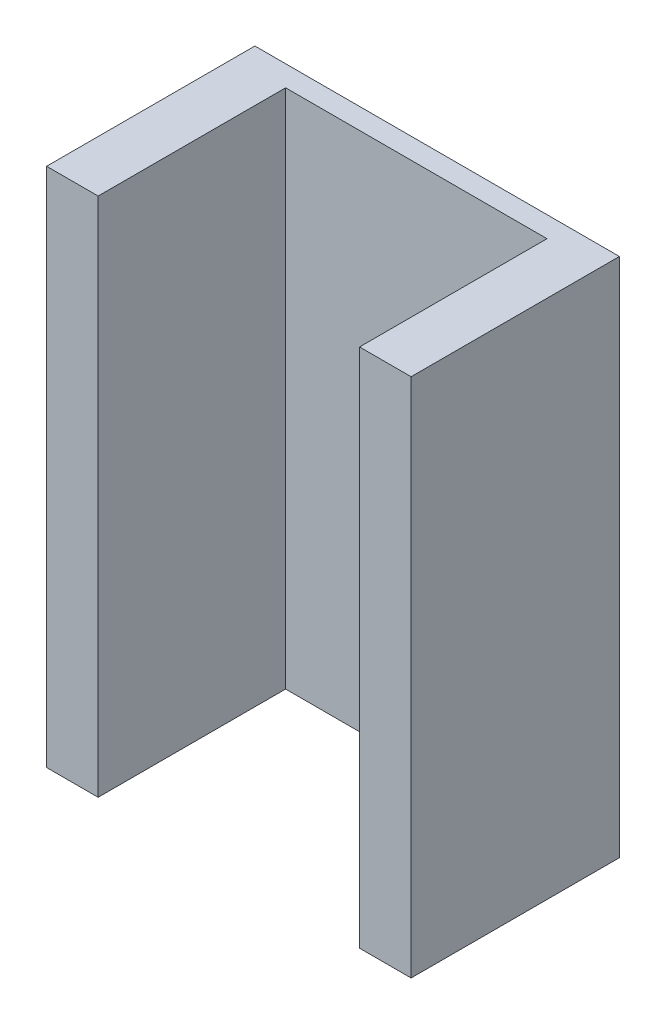
ISO-10303-21;
HEADER;
FILE_DESCRIPTION(('STEP AP214'),'2;1');
FILE_NAME('part.step','',(''),(''),'','','');
FILE_SCHEMA(('AUTOMOTIVE_DESIGN { 1 0 10303 214 1 1 1 1 }'));
ENDSEC;
DATA;
#1=APPLICATION_CONTEXT('core data for automotive mechanical design processes');
#2=APPLICATION_PROTOCOL_DEFINITION('international standard','automotive_design',2000,#1);
#3=PRODUCT_CONTEXT('',#1,'mechanical');
#4=PRODUCT('Part','Part','',(#3));
#5=PRODUCT_RELATED_PRODUCT_CATEGORY('part','',(#4));
#6=PRODUCT_DEFINITION_FORMATION('','',#4);
#7=PRODUCT_DEFINITION_CONTEXT('part definition',#1,'design');
#8=PRODUCT_DEFINITION('design','',#6,#7);
#9=PRODUCT_DEFINITION_SHAPE('','',#8);
#10=(LENGTH_UNIT() NAMED_UNIT(*) SI_UNIT(.MILLI.,.METRE.));
#11=(NAMED_UNIT(*) PLANE_ANGLE_UNIT() SI_UNIT($,.RADIAN.));
#12=(NAMED_UNIT(*) SI_UNIT($,.STERADIAN.) SOLID_ANGLE_UNIT());
#13=UNCERTAINTY_MEASURE_WITH_UNIT(LENGTH_MEASURE(1.E-05),#10,'distance_accuracy_value','');
#14=(GEOMETRIC_REPRESENTATION_CONTEXT(3) GLOBAL_UNCERTAINTY_ASSIGNED_CONTEXT((#13)) GLOBAL_UNIT_ASSIGNED_CONTEXT((#10,
#11,#12)) REPRESENTATION_CONTEXT('',''));
#15=CARTESIAN_POINT('',(0.,0.,0.));
#16=DIRECTION('',(0.,0.,1.));
#17=DIRECTION('',(1.,0.,0.));
#18=AXIS2_PLACEMENT_3D('',#15,#16,#17);
#19=CARTESIAN_POINT('',(0.,0.,40.));
#20=DIRECTION('',(0.,0.,-1.));
#21=DIRECTION('',(-1.,0.,0.));
#22=AXIS2_PLACEMENT_3D('',#19,#20,#21);
#23=PLANE('',#22);
#24=DIRECTION('',(1.,0.,0.));
#25=VECTOR('',#24,1.);
#26=CARTESIAN_POINT('',(0.,0.,40.));
#27=LINE('',#26,#25);
#28=CARTESIAN_POINT('',(0.,0.,40.));
#29=VERTEX_POINT('',#28);
#30=CARTESIAN_POINT('',(9.90000000000001,0.,40.));
#31=VERTEX_POINT('',#30);
#32=EDGE_CURVE('E91',#29,#31,#27,.T.);
#33=ORIENTED_EDGE('',*,*,#32,.T.);
#34=DIRECTION('',(0.,-1.,0.));
#35=VECTOR('',#34,1.);
#36=CARTESIAN_POINT('',(9.9,100.,40.));
#37=LINE('',#36,#35);
#38=CARTESIAN_POINT('',(9.9,100.,40.));
#39=VERTEX_POINT('',#38);
#40=EDGE_CURVE('E117',#39,#31,#37,.T.);
#41=ORIENTED_EDGE('',*,*,#40,.F.);
#42=DIRECTION('',(-1.,0.,0.));
#43=VECTOR('',#42,1.);
#44=CARTESIAN_POINT('',(0.,100.,40.));
#45=LINE('',#44,#43);
#46=CARTESIAN_POINT('',(0.,100.,40.));
#47=VERTEX_POINT('',#46);
#48=EDGE_CURVE('E62',#39,#47,#45,.T.);
#49=ORIENTED_EDGE('',*,*,#48,.T.);
#50=DIRECTION('',(0.,-1.,0.));
#51=VECTOR('',#50,1.);
#52=CARTESIAN_POINT('',(0.,0.,40.));
#53=LINE('',#52,#51);
#54=EDGE_CURVE('E148',#47,#29,#53,.T.);
#55=ORIENTED_EDGE('',*,*,#54,.T.);
#56=EDGE_LOOP('',(#33,#41,#49,#55));
#57=FACE_BOUND('',#56,.T.);
#58=ADVANCED_FACE('F38',(#57),#23,.F.);
#59=CARTESIAN_POINT('',(0.,0.,40.));
#60=DIRECTION('',(1.,0.,0.));
#61=DIRECTION('',(0.,0.,-1.));
#62=AXIS2_PLACEMENT_3D('',#59,#60,#61);
#63=PLANE('',#62);
#64=DIRECTION('',(0.,-1.,0.));
#65=VECTOR('',#64,1.);
#66=CARTESIAN_POINT('',(0.,0.,0.));
#67=LINE('',#66,#65);
#68=CARTESIAN_POINT('',(0.,100.,0.));
#69=VERTEX_POINT('',#68);
#70=CARTESIAN_POINT('',(0.,0.,0.));
#71=VERTEX_POINT('',#70);
#72=EDGE_CURVE('E143',#69,#71,#67,.T.);
#73=ORIENTED_EDGE('',*,*,#72,.T.);
#74=DIRECTION('',(0.,0.,-1.));
#75=VECTOR('',#74,1.);
#76=CARTESIAN_POINT('',(0.,0.,40.));
#77=LINE('',#76,#75);
#78=EDGE_CURVE('E11',#29,#71,#77,.T.);
#79=ORIENTED_EDGE('',*,*,#78,.F.);
#80=ORIENTED_EDGE('',*,*,#54,.F.);
#81=DIRECTION('',(0.,0.,-1.));
#82=VECTOR('',#81,1.);
#83=CARTESIAN_POINT('',(0.,100.,40.));
#84=LINE('',#83,#82);
#85=EDGE_CURVE('E157',#47,#69,#84,.T.);
#86=ORIENTED_EDGE('',*,*,#85,.T.);
#87=EDGE_LOOP('',(#73,#79,#80,#86));
#88=FACE_BOUND('',#87,.T.);
#89=ADVANCED_FACE('F40',(#88),#63,.F.);
#90=CARTESIAN_POINT('',(0.,0.,40.));
#91=DIRECTION('',(0.,1.,0.));
#92=DIRECTION('',(0.,0.,1.));
#93=AXIS2_PLACEMENT_3D('',#90,#91,#92);
#94=PLANE('',#93);
#95=DIRECTION('',(1.,0.,0.));
#96=VECTOR('',#95,1.);
#97=CARTESIAN_POINT('',(9.90000000000001,0.,4.));
#98=LINE('',#97,#96);
#99=CARTESIAN_POINT('',(9.90000000000001,0.,4.));
#100=VERTEX_POINT('',#99);
#101=CARTESIAN_POINT('',(60.1,0.,4.));
#102=VERTEX_POINT('',#101);
#103=EDGE_CURVE('E125',#100,#102,#98,.T.);
#104=ORIENTED_EDGE('',*,*,#103,.F.);
#105=DIRECTION('',(0.,0.,1.));
#106=VECTOR('',#105,1.);
#107=CARTESIAN_POINT('',(9.90000000000001,0.,4.));
#108=LINE('',#107,#106);
#109=EDGE_CURVE('E112',#100,#31,#108,.T.);
#110=ORIENTED_EDGE('',*,*,#109,.T.);
#111=ORIENTED_EDGE('',*,*,#32,.F.);
#112=ORIENTED_EDGE('',*,*,#78,.T.);
#113=DIRECTION('',(1.,0.,0.));
#114=VECTOR('',#113,1.);
#115=CARTESIAN_POINT('',(0.,0.,0.));
#116=LINE('',#115,#114);
#117=CARTESIAN_POINT('',(70.,0.,0.));
#118=VERTEX_POINT('',#117);
#119=EDGE_CURVE('E160',#71,#118,#116,.T.);
#120=ORIENTED_EDGE('',*,*,#119,.T.);
#121=DIRECTION('',(0.,0.,-1.));
#122=VECTOR('',#121,1.);
#123=CARTESIAN_POINT('',(70.,0.,40.));
#124=LINE('',#123,#122);
#125=CARTESIAN_POINT('',(70.,0.,40.));
#126=VERTEX_POINT('',#125);
#127=EDGE_CURVE('E46',#126,#118,#124,.T.);
#128=ORIENTED_EDGE('',*,*,#127,.F.);
#129=CARTESIAN_POINT('',(60.1,0.,40.));
#130=VERTEX_POINT('',#129);
#131=EDGE_CURVE('E150',#130,#126,#27,.T.);
#132=ORIENTED_EDGE('',*,*,#131,.F.);
#133=DIRECTION('',(0.,0.,1.));
#134=VECTOR('',#133,1.);
#135=CARTESIAN_POINT('',(60.1,0.,4.));
#136=LINE('',#135,#134);
#137=EDGE_CURVE('E53',#102,#130,#136,.T.);
#138=ORIENTED_EDGE('',*,*,#137,.F.);
#139=EDGE_LOOP('',(#104,#110,#111,#112,#120,#128,#132,#138));
#140=FACE_BOUND('',#139,.T.);
#141=ADVANCED_FACE('F130',(#140),#94,.F.);
#142=CARTESIAN_POINT('',(70.,0.,40.));
#143=DIRECTION('',(-1.,0.,0.));
#144=DIRECTION('',(0.,0.,1.));
#145=AXIS2_PLACEMENT_3D('',#142,#143,#144);
#146=PLANE('',#145);
#147=DIRECTION('',(0.,1.,0.));
#148=VECTOR('',#147,1.);
#149=CARTESIAN_POINT('',(70.,0.,0.));
#150=LINE('',#149,#148);
#151=CARTESIAN_POINT('',(70.,100.,0.));
#152=VERTEX_POINT('',#151);
#153=EDGE_CURVE('E162',#118,#152,#150,.T.);
#154=ORIENTED_EDGE('',*,*,#153,.T.);
#155=DIRECTION('',(0.,0.,-1.));
#156=VECTOR('',#155,1.);
#157=CARTESIAN_POINT('',(70.,100.,40.));
#158=LINE('',#157,#156);
#159=CARTESIAN_POINT('',(70.,100.,40.));
#160=VERTEX_POINT('',#159);
#161=EDGE_CURVE('E166',#160,#152,#158,.T.);
#162=ORIENTED_EDGE('',*,*,#161,.F.);
#163=DIRECTION('',(0.,1.,0.));
#164=VECTOR('',#163,1.);
#165=CARTESIAN_POINT('',(70.,0.,40.));
#166=LINE('',#165,#164);
#167=EDGE_CURVE('E152',#126,#160,#166,.T.);
#168=ORIENTED_EDGE('',*,*,#167,.F.);
#169=ORIENTED_EDGE('',*,*,#127,.T.);
#170=EDGE_LOOP('',(#154,#162,#168,#169));
#171=FACE_BOUND('',#170,.T.);
#172=ADVANCED_FACE('F172',(#171),#146,.F.);
#173=CARTESIAN_POINT('',(0.,100.,40.));
#174=DIRECTION('',(0.,-1.,0.));
#175=DIRECTION('',(0.,0.,-1.));
#176=AXIS2_PLACEMENT_3D('',#173,#174,#175);
#177=PLANE('',#176);
#178=ORIENTED_EDGE('',*,*,#48,.F.);
#179=DIRECTION('',(0.,0.,1.));
#180=VECTOR('',#179,1.);
#181=CARTESIAN_POINT('',(9.9,100.,4.));
#182=LINE('',#181,#180);
#183=CARTESIAN_POINT('',(9.9,100.,4.));
#184=VERTEX_POINT('',#183);
#185=EDGE_CURVE('E141',#184,#39,#182,.T.);
#186=ORIENTED_EDGE('',*,*,#185,.F.);
#187=DIRECTION('',(-1.,0.,0.));
#188=VECTOR('',#187,1.);
#189=CARTESIAN_POINT('',(9.9,100.,4.));
#190=LINE('',#189,#188);
#191=CARTESIAN_POINT('',(60.1,100.,4.));
#192=VERTEX_POINT('',#191);
#193=EDGE_CURVE('E119',#192,#184,#190,.T.);
#194=ORIENTED_EDGE('',*,*,#193,.F.);
#195=DIRECTION('',(0.,0.,1.));
#196=VECTOR('',#195,1.);
#197=CARTESIAN_POINT('',(60.1,100.,4.));
#198=LINE('',#197,#196);
#199=CARTESIAN_POINT('',(60.1,100.,40.));
#200=VERTEX_POINT('',#199);
#201=EDGE_CURVE('E144',#192,#200,#198,.T.);
#202=ORIENTED_EDGE('',*,*,#201,.T.);
#203=EDGE_CURVE('E154',#160,#200,#45,.T.);
#204=ORIENTED_EDGE('',*,*,#203,.F.);
#205=ORIENTED_EDGE('',*,*,#161,.T.);
#206=DIRECTION('',(-1.,0.,0.));
#207=VECTOR('',#206,1.);
#208=CARTESIAN_POINT('',(0.,100.,0.));
#209=LINE('',#208,#207);
#210=EDGE_CURVE('E84',#152,#69,#209,.T.);
#211=ORIENTED_EDGE('',*,*,#210,.T.);
#212=ORIENTED_EDGE('',*,*,#85,.F.);
#213=EDGE_LOOP('',(#178,#186,#194,#202,#204,#205,#211,#212));
#214=FACE_BOUND('',#213,.T.);
#215=ADVANCED_FACE('F180',(#214),#177,.F.);
#216=ORIENTED_EDGE('',*,*,#203,.T.);
#217=DIRECTION('',(0.,1.,0.));
#218=VECTOR('',#217,1.);
#219=CARTESIAN_POINT('',(60.1,100.,40.));
#220=LINE('',#219,#218);
#221=EDGE_CURVE('E128',#130,#200,#220,.T.);
#222=ORIENTED_EDGE('',*,*,#221,.F.);
#223=ORIENTED_EDGE('',*,*,#131,.T.);
#224=ORIENTED_EDGE('',*,*,#167,.T.);
#225=EDGE_LOOP('',(#216,#222,#223,#224));
#226=FACE_BOUND('',#225,.T.);
#227=ADVANCED_FACE('F183',(#226),#23,.F.);
#228=CARTESIAN_POINT('',(0.,0.,0.));
#229=DIRECTION('',(0.,0.,-1.));
#230=DIRECTION('',(-1.,0.,0.));
#231=AXIS2_PLACEMENT_3D('',#228,#229,#230);
#232=PLANE('',#231);
#233=CARTESIAN_POINT('',(35.0981544633332,42.9137063083217,0.));
#234=DIRECTION('',(0.,0.,-1.));
#235=DIRECTION('',(-1.,0.,0.));
#236=AXIS2_PLACEMENT_3D('',#233,#234,#235);
#237=CIRCLE('',#236,0.799974647910638);
#238=CARTESIAN_POINT('',(34.2981798154225,42.9137063083217,0.));
#239=VERTEX_POINT('',#238);
#240=EDGE_CURVE('E232',#239,#239,#237,.F.);
#241=ORIENTED_EDGE('',*,*,#240,.T.);
#242=EDGE_LOOP('',(#241));
#243=FACE_BOUND('',#242,.T.);
#244=CARTESIAN_POINT('',(28.0960629073419,49.91134602095,0.));
#245=DIRECTION('',(0.,0.,-1.));
#246=DIRECTION('',(-1.,0.,0.));
#247=AXIS2_PLACEMENT_3D('',#244,#245,#246);
#248=CIRCLE('',#247,0.799973526707412);
#249=CARTESIAN_POINT('',(27.2960893806345,49.91134602095,0.));
#250=VERTEX_POINT('',#249);
#251=EDGE_CURVE('E244',#250,#250,#248,.F.);
#252=ORIENTED_EDGE('',*,*,#251,.T.);
#253=EDGE_LOOP('',(#252));
#254=FACE_BOUND('',#253,.T.);
#255=CARTESIAN_POINT('',(35.0934374797689,56.9137055095387,0.));
#256=DIRECTION('',(0.,0.,-1.));
#257=DIRECTION('',(-1.,0.,0.));
#258=AXIS2_PLACEMENT_3D('',#255,#256,#257);
#259=CIRCLE('',#258,0.799971754188049);
#260=CARTESIAN_POINT('',(34.2934657255808,56.9137055095387,0.));
#261=VERTEX_POINT('',#260);
#262=EDGE_CURVE('E250',#261,#261,#259,.F.);
#263=ORIENTED_EDGE('',*,*,#262,.T.);
#264=EDGE_LOOP('',(#263));
#265=FACE_BOUND('',#264,.T.);
#266=CARTESIAN_POINT('',(42.0955290355668,49.9160657970041,0.));
#267=DIRECTION('',(0.,0.,-1.));
#268=DIRECTION('',(-1.,0.,0.));
#269=AXIS2_PLACEMENT_3D('',#266,#267,#268);
#270=CIRCLE('',#269,0.799972464394915);
#271=CARTESIAN_POINT('',(41.2955565711719,49.9160657970041,0.));
#272=VERTEX_POINT('',#271);
#273=EDGE_CURVE('E256',#272,#272,#270,.F.);
#274=ORIENTED_EDGE('',*,*,#273,.T.);
#275=EDGE_LOOP('',(#274));
#276=FACE_BOUND('',#275,.T.);
#277=CARTESIAN_POINT('',(35.,50.,0.));
#278=DIRECTION('',(0.,0.,-1.));
#279=DIRECTION('',(-1.,0.,0.));
#280=AXIS2_PLACEMENT_3D('',#277,#278,#279);
#281=CIRCLE('',#280,1.5);
#282=CARTESIAN_POINT('',(33.5,50.,0.));
#283=VERTEX_POINT('',#282);
#284=EDGE_CURVE('E139',#283,#283,#281,.T.);
#285=ORIENTED_EDGE('',*,*,#284,.F.);
#286=EDGE_LOOP('',(#285));
#287=FACE_BOUND('',#286,.T.);
#288=ORIENTED_EDGE('',*,*,#72,.F.);
#289=ORIENTED_EDGE('',*,*,#210,.F.);
#290=ORIENTED_EDGE('',*,*,#153,.F.);
#291=ORIENTED_EDGE('',*,*,#119,.F.);
#292=EDGE_LOOP('',(#288,#289,#290,#291));
#293=FACE_BOUND('',#292,.T.);
#294=ADVANCED_FACE('F176',(#243,#254,#265,#276,#287,#293),#232,.T.);
#295=CARTESIAN_POINT('',(9.9,100.,4.));
#296=DIRECTION('',(-1.,0.,0.));
#297=DIRECTION('',(0.,-1.,0.));
#298=AXIS2_PLACEMENT_3D('',#295,#296,#297);
#299=PLANE('',#298);
#300=ORIENTED_EDGE('',*,*,#40,.T.);
#301=ORIENTED_EDGE('',*,*,#109,.F.);
#302=DIRECTION('',(0.,-1.,0.));
#303=VECTOR('',#302,1.);
#304=CARTESIAN_POINT('',(9.9,100.,4.));
#305=LINE('',#304,#303);
#306=EDGE_CURVE('E115',#184,#100,#305,.T.);
#307=ORIENTED_EDGE('',*,*,#306,.F.);
#308=ORIENTED_EDGE('',*,*,#185,.T.);
#309=EDGE_LOOP('',(#300,#301,#307,#308));
#310=FACE_BOUND('',#309,.T.);
#311=ADVANCED_FACE('F114',(#310),#299,.F.);
#312=CARTESIAN_POINT('',(60.1,100.,4.));
#313=DIRECTION('',(1.,0.,0.));
#314=DIRECTION('',(0.,1.,0.));
#315=AXIS2_PLACEMENT_3D('',#312,#313,#314);
#316=PLANE('',#315);
#317=ORIENTED_EDGE('',*,*,#221,.T.);
#318=ORIENTED_EDGE('',*,*,#201,.F.);
#319=DIRECTION('',(0.,1.,0.));
#320=VECTOR('',#319,1.);
#321=CARTESIAN_POINT('',(60.1,100.,4.));
#322=LINE('',#321,#320);
#323=EDGE_CURVE('E132',#102,#192,#322,.T.);
#324=ORIENTED_EDGE('',*,*,#323,.F.);
#325=ORIENTED_EDGE('',*,*,#137,.T.);
#326=EDGE_LOOP('',(#317,#318,#324,#325));
#327=FACE_BOUND('',#326,.T.);
#328=ADVANCED_FACE('F198',(#327),#316,.F.);
#329=CARTESIAN_POINT('',(0.,0.,4.));
#330=DIRECTION('',(0.,0.,1.));
#331=DIRECTION('',(1.,0.,0.));
#332=AXIS2_PLACEMENT_3D('',#329,#330,#331);
#333=PLANE('',#332);
#334=CARTESIAN_POINT('',(35.0981544633332,42.9137063083217,4.));
#335=DIRECTION('',(0.,0.,1.));
#336=DIRECTION('',(1.,0.,0.));
#337=AXIS2_PLACEMENT_3D('',#334,#335,#336);
#338=CIRCLE('',#337,0.799974647910638);
#339=CARTESIAN_POINT('',(35.8981291112438,42.9137063083217,4.));
#340=VERTEX_POINT('',#339);
#341=EDGE_CURVE('E235',#340,#340,#338,.T.);
#342=ORIENTED_EDGE('',*,*,#341,.F.);
#343=EDGE_LOOP('',(#342));
#344=FACE_BOUND('',#343,.T.);
#345=CARTESIAN_POINT('',(28.0960629073419,49.91134602095,4.));
#346=DIRECTION('',(0.,0.,1.));
#347=DIRECTION('',(1.,0.,0.));
#348=AXIS2_PLACEMENT_3D('',#345,#346,#347);
#349=CIRCLE('',#348,0.799973526707412);
#350=CARTESIAN_POINT('',(28.8960364340494,49.91134602095,4.));
#351=VERTEX_POINT('',#350);
#352=EDGE_CURVE('E239',#351,#351,#349,.T.);
#353=ORIENTED_EDGE('',*,*,#352,.F.);
#354=EDGE_LOOP('',(#353));
#355=FACE_BOUND('',#354,.T.);
#356=CARTESIAN_POINT('',(35.0934374797689,56.9137055095387,4.));
#357=DIRECTION('',(0.,0.,1.));
#358=DIRECTION('',(1.,0.,0.));
#359=AXIS2_PLACEMENT_3D('',#356,#357,#358);
#360=CIRCLE('',#359,0.799971754188049);
#361=CARTESIAN_POINT('',(35.8934092339569,56.9137055095387,4.));
#362=VERTEX_POINT('',#361);
#363=EDGE_CURVE('E247',#362,#362,#360,.T.);
#364=ORIENTED_EDGE('',*,*,#363,.F.);
#365=EDGE_LOOP('',(#364));
#366=FACE_BOUND('',#365,.T.);
#367=CARTESIAN_POINT('',(42.0955290355668,49.9160657970041,4.));
#368=DIRECTION('',(0.,0.,1.));
#369=DIRECTION('',(1.,0.,0.));
#370=AXIS2_PLACEMENT_3D('',#367,#368,#369);
#371=CIRCLE('',#370,0.799972464394915);
#372=CARTESIAN_POINT('',(42.8955014999617,49.9160657970041,4.));
#373=VERTEX_POINT('',#372);
#374=EDGE_CURVE('E253',#373,#373,#371,.T.);
#375=ORIENTED_EDGE('',*,*,#374,.F.);
#376=EDGE_LOOP('',(#375));
#377=FACE_BOUND('',#376,.T.);
#378=CARTESIAN_POINT('',(35.,50.,4.));
#379=DIRECTION('',(0.,0.,1.));
#380=DIRECTION('',(1.,0.,0.));
#381=AXIS2_PLACEMENT_3D('',#378,#379,#380);
#382=CIRCLE('',#381,1.5);
#383=CARTESIAN_POINT('',(36.5,50.,4.));
#384=VERTEX_POINT('',#383);
#385=EDGE_CURVE('E236',#384,#384,#382,.F.);
#386=ORIENTED_EDGE('',*,*,#385,.T.);
#387=EDGE_LOOP('',(#386));
#388=FACE_BOUND('',#387,.T.);
#389=ORIENTED_EDGE('',*,*,#306,.T.);
#390=ORIENTED_EDGE('',*,*,#103,.T.);
#391=ORIENTED_EDGE('',*,*,#323,.T.);
#392=ORIENTED_EDGE('',*,*,#193,.T.);
#393=EDGE_LOOP('',(#389,#390,#391,#392));
#394=FACE_BOUND('',#393,.T.);
#395=ADVANCED_FACE('F123',(#344,#355,#366,#377,#388,#394),#333,.T.);
#396=CARTESIAN_POINT('',(35.,50.,40.001));
#397=DIRECTION('',(0.,0.,-1.));
#398=DIRECTION('',(-1.,0.,0.));
#399=AXIS2_PLACEMENT_3D('',#396,#397,#398);
#400=CYLINDRICAL_SURFACE('',#399,1.5);
#401=ORIENTED_EDGE('',*,*,#385,.F.);
#402=EDGE_LOOP('',(#401));
#403=FACE_BOUND('',#402,.T.);
#404=ORIENTED_EDGE('',*,*,#284,.T.);
#405=EDGE_LOOP('',(#404));
#406=FACE_BOUND('',#405,.T.);
#407=ADVANCED_FACE('F205',(#403,#406),#400,.F.);
#408=CARTESIAN_POINT('',(42.0955290355668,49.9160657970041,-0.00100000000000013));
#409=DIRECTION('',(0.,0.,1.));
#410=DIRECTION('',(1.,0.,0.));
#411=AXIS2_PLACEMENT_3D('',#408,#409,#410);
#412=CYLINDRICAL_SURFACE('',#411,0.799972464394915);
#413=ORIENTED_EDGE('',*,*,#273,.F.);
#414=EDGE_LOOP('',(#413));
#415=FACE_BOUND('',#414,.T.);
#416=ORIENTED_EDGE('',*,*,#374,.T.);
#417=EDGE_LOOP('',(#416));
#418=FACE_BOUND('',#417,.T.);
#419=ADVANCED_FACE('F211',(#415,#418),#412,.F.);
#420=CARTESIAN_POINT('',(35.0934374797689,56.9137055095387,-0.00100000000000013));
#421=DIRECTION('',(0.,0.,1.));
#422=DIRECTION('',(1.,0.,0.));
#423=AXIS2_PLACEMENT_3D('',#420,#421,#422);
#424=CYLINDRICAL_SURFACE('',#423,0.799971754188049);
#425=ORIENTED_EDGE('',*,*,#262,.F.);
#426=EDGE_LOOP('',(#425));
#427=FACE_BOUND('',#426,.T.);
#428=ORIENTED_EDGE('',*,*,#363,.T.);
#429=EDGE_LOOP('',(#428));
#430=FACE_BOUND('',#429,.T.);
#431=ADVANCED_FACE('F215',(#427,#430),#424,.F.);
#432=CARTESIAN_POINT('',(28.0960629073419,49.91134602095,-0.00100000000000013));
#433=DIRECTION('',(0.,0.,1.));
#434=DIRECTION('',(1.,0.,0.));
#435=AXIS2_PLACEMENT_3D('',#432,#433,#434);
#436=CYLINDRICAL_SURFACE('',#435,0.799973526707412);
#437=ORIENTED_EDGE('',*,*,#251,.F.);
#438=EDGE_LOOP('',(#437));
#439=FACE_BOUND('',#438,.T.);
#440=ORIENTED_EDGE('',*,*,#352,.T.);
#441=EDGE_LOOP('',(#440));
#442=FACE_BOUND('',#441,.T.);
#443=ADVANCED_FACE('F219',(#439,#442),#436,.F.);
#444=CARTESIAN_POINT('',(35.0981544633332,42.9137063083217,-0.00100000000000013));
#445=DIRECTION('',(0.,0.,1.));
#446=DIRECTION('',(1.,0.,0.));
#447=AXIS2_PLACEMENT_3D('',#444,#445,#446);
#448=CYLINDRICAL_SURFACE('',#447,0.799974647910638);
#449=ORIENTED_EDGE('',*,*,#240,.F.);
#450=EDGE_LOOP('',(#449));
#451=FACE_BOUND('',#450,.T.);
#452=ORIENTED_EDGE('',*,*,#341,.T.);
#453=EDGE_LOOP('',(#452));
#454=FACE_BOUND('',#453,.T.);
#455=ADVANCED_FACE('F223',(#451,#454),#448,.F.);
#456=CLOSED_SHELL('',(#58,#89,#141,#172,#215,#227,#294,#311,#328,#395,#407,#419,#431,#443,#455));
#457=MANIFOLD_SOLID_BREP('B2',#456);
#458=ADVANCED_BREP_SHAPE_REPRESENTATION('',(#18,#457),#14);
#459=SHAPE_DEFINITION_REPRESENTATION(#9,#458);
ENDSEC;
END-ISO-10303-21;
